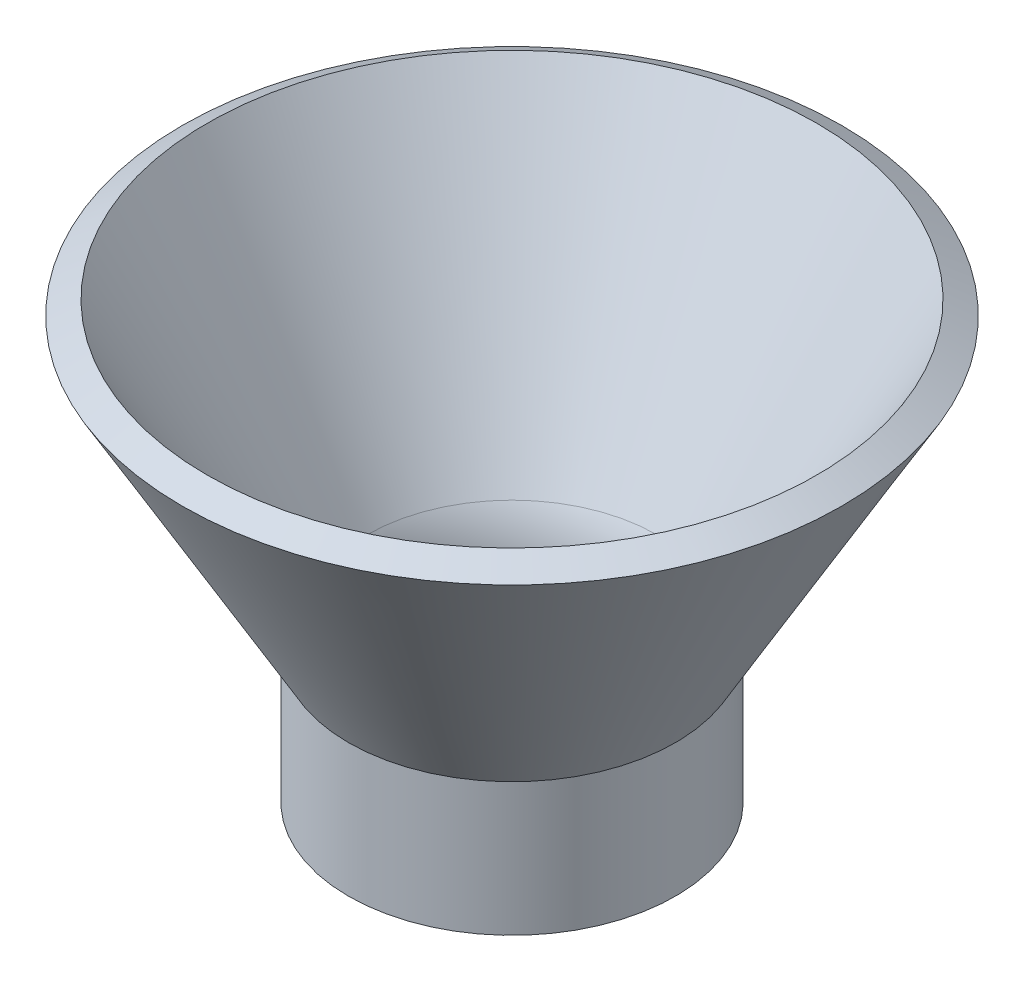
ISO-10303-21;
HEADER;
FILE_DESCRIPTION(('STEP AP214'),'2;1');
FILE_NAME('part.step','',(''),(''),'','','');
FILE_SCHEMA(('AUTOMOTIVE_DESIGN { 1 0 10303 214 1 1 1 1 }'));
ENDSEC;
DATA;
#1=APPLICATION_CONTEXT('core data for automotive mechanical design processes');
#2=APPLICATION_PROTOCOL_DEFINITION('international standard','automotive_design',2000,#1);
#3=PRODUCT_CONTEXT('',#1,'mechanical');
#4=PRODUCT('Part','Part','',(#3));
#5=PRODUCT_RELATED_PRODUCT_CATEGORY('part','',(#4));
#6=PRODUCT_DEFINITION_FORMATION('','',#4);
#7=PRODUCT_DEFINITION_CONTEXT('part definition',#1,'design');
#8=PRODUCT_DEFINITION('design','',#6,#7);
#9=PRODUCT_DEFINITION_SHAPE('','',#8);
#10=(LENGTH_UNIT() NAMED_UNIT(*) SI_UNIT(.MILLI.,.METRE.));
#11=(NAMED_UNIT(*) PLANE_ANGLE_UNIT() SI_UNIT($,.RADIAN.));
#12=(NAMED_UNIT(*) SI_UNIT($,.STERADIAN.) SOLID_ANGLE_UNIT());
#13=UNCERTAINTY_MEASURE_WITH_UNIT(LENGTH_MEASURE(1.E-05),#10,'distance_accuracy_value','');
#14=(GEOMETRIC_REPRESENTATION_CONTEXT(3) GLOBAL_UNCERTAINTY_ASSIGNED_CONTEXT((#13)) GLOBAL_UNIT_ASSIGNED_CONTEXT((#10,
#11,#12)) REPRESENTATION_CONTEXT('',''));
#15=CARTESIAN_POINT('',(0.,0.,0.));
#16=DIRECTION('',(0.,0.,1.));
#17=DIRECTION('',(1.,0.,0.));
#18=AXIS2_PLACEMENT_3D('',#15,#16,#17);
#19=CARTESIAN_POINT('',(0.,0.,0.));
#20=DIRECTION('',(0.,1.,0.));
#21=DIRECTION('',(0.,0.,1.));
#22=AXIS2_PLACEMENT_3D('',#19,#20,#21);
#23=PLANE('',#22);
#24=CARTESIAN_POINT('',(0.,0.,0.));
#25=DIRECTION('',(0.,1.,0.));
#26=DIRECTION('',(0.,0.,1.));
#27=AXIS2_PLACEMENT_3D('',#24,#25,#26);
#28=CIRCLE('',#27,14.75);
#29=CARTESIAN_POINT('',(0.,0.,14.75));
#30=VERTEX_POINT('',#29);
#31=EDGE_CURVE('E55',#30,#30,#28,.T.);
#32=ORIENTED_EDGE('',*,*,#31,.F.);
#33=EDGE_LOOP('',(#32));
#34=FACE_BOUND('',#33,.T.);
#35=CARTESIAN_POINT('',(0.,0.,0.));
#36=DIRECTION('',(0.,1.,0.));
#37=DIRECTION('',(0.,0.,1.));
#38=AXIS2_PLACEMENT_3D('',#35,#36,#37);
#39=CIRCLE('',#38,11.75);
#40=CARTESIAN_POINT('',(0.,0.,11.75));
#41=VERTEX_POINT('',#40);
#42=EDGE_CURVE('E60',#41,#41,#39,.T.);
#43=ORIENTED_EDGE('',*,*,#42,.T.);
#44=EDGE_LOOP('',(#43));
#45=FACE_BOUND('',#44,.T.);
#46=ADVANCED_FACE('F37',(#34,#45),#23,.F.);
#47=CARTESIAN_POINT('',(0.,12.,0.));
#48=DIRECTION('',(0.,-1.,0.));
#49=DIRECTION('',(0.,0.,-1.));
#50=AXIS2_PLACEMENT_3D('',#47,#48,#49);
#51=CYLINDRICAL_SURFACE('',#50,14.75);
#52=CARTESIAN_POINT('',(0.,12.,0.));
#53=DIRECTION('',(0.,1.,0.));
#54=DIRECTION('',(0.,0.,1.));
#55=AXIS2_PLACEMENT_3D('',#52,#53,#54);
#56=CIRCLE('',#55,14.75);
#57=CARTESIAN_POINT('',(0.,12.,14.75));
#58=VERTEX_POINT('',#57);
#59=EDGE_CURVE('E50',#58,#58,#56,.T.);
#60=ORIENTED_EDGE('',*,*,#59,.F.);
#61=EDGE_LOOP('',(#60));
#62=FACE_BOUND('',#61,.T.);
#63=ORIENTED_EDGE('',*,*,#31,.T.);
#64=EDGE_LOOP('',(#63));
#65=FACE_BOUND('',#64,.T.);
#66=ADVANCED_FACE('F88',(#62,#65),#51,.T.);
#67=CARTESIAN_POINT('',(0.,12.,0.));
#68=DIRECTION('',(0.,-1.,0.));
#69=DIRECTION('',(0.,0.,-1.));
#70=AXIS2_PLACEMENT_3D('',#67,#68,#69);
#71=CYLINDRICAL_SURFACE('',#70,11.75);
#72=CARTESIAN_POINT('',(0.,9.3205080756888,0.));
#73=DIRECTION('',(0.,1.,0.));
#74=DIRECTION('',(0.,0.,1.));
#75=AXIS2_PLACEMENT_3D('',#72,#73,#74);
#76=CIRCLE('',#75,11.75);
#77=CARTESIAN_POINT('',(0.,9.3205080756888,11.75));
#78=VERTEX_POINT('',#77);
#79=EDGE_CURVE('E10',#78,#78,#76,.T.);
#80=ORIENTED_EDGE('',*,*,#79,.T.);
#81=EDGE_LOOP('',(#80));
#82=FACE_BOUND('',#81,.T.);
#83=ORIENTED_EDGE('',*,*,#42,.F.);
#84=EDGE_LOOP('',(#83));
#85=FACE_BOUND('',#84,.T.);
#86=ADVANCED_FACE('F94',(#82,#85),#71,.F.);
#87=CARTESIAN_POINT('',(0.,37.9807621135332,0.));
#88=DIRECTION('',(0.,1.,0.));
#89=DIRECTION('',(0.,0.,1.));
#90=AXIS2_PLACEMENT_3D('',#87,#88,#89);
#91=CONICAL_SURFACE('',#90,29.7499999999999,0.523598775598293);
#92=ORIENTED_EDGE('',*,*,#59,.T.);
#93=EDGE_LOOP('',(#92));
#94=FACE_BOUND('',#93,.T.);
#95=CARTESIAN_POINT('',(0.,37.9807621135332,0.));
#96=DIRECTION('',(0.,-1.,0.));
#97=DIRECTION('',(0.,0.,-1.));
#98=AXIS2_PLACEMENT_3D('',#95,#96,#97);
#99=CIRCLE('',#98,29.7499999999999);
#100=CARTESIAN_POINT('',(0.,37.9807621135332,-29.7499999999999));
#101=VERTEX_POINT('',#100);
#102=EDGE_CURVE('E65',#101,#101,#99,.T.);
#103=ORIENTED_EDGE('',*,*,#102,.T.);
#104=EDGE_LOOP('',(#103));
#105=FACE_BOUND('',#104,.T.);
#106=ADVANCED_FACE('F84',(#94,#105),#91,.T.);
#107=CARTESIAN_POINT('',(0.,39.2798002192099,0.));
#108=DIRECTION('',(0.,-1.,0.));
#109=DIRECTION('',(0.,0.,-1.));
#110=AXIS2_PLACEMENT_3D('',#107,#108,#109);
#111=CONICAL_SURFACE('',#110,27.4999999999998,1.0471975511966);
#112=ORIENTED_EDGE('',*,*,#102,.F.);
#113=EDGE_LOOP('',(#112));
#114=FACE_BOUND('',#113,.T.);
#115=CARTESIAN_POINT('',(0.,39.2798002192099,0.));
#116=DIRECTION('',(0.,-1.,0.));
#117=DIRECTION('',(0.,0.,-1.));
#118=AXIS2_PLACEMENT_3D('',#115,#116,#117);
#119=CIRCLE('',#118,27.4999999999998);
#120=CARTESIAN_POINT('',(0.,39.2798002192099,-27.4999999999998));
#121=VERTEX_POINT('',#120);
#122=EDGE_CURVE('E69',#121,#121,#119,.T.);
#123=ORIENTED_EDGE('',*,*,#122,.T.);
#124=EDGE_LOOP('',(#123));
#125=FACE_BOUND('',#124,.T.);
#126=ADVANCED_FACE('F74',(#114,#125),#111,.T.);
#127=CARTESIAN_POINT('',(0.,12.,0.));
#128=DIRECTION('',(0.,1.,0.));
#129=DIRECTION('',(0.,0.,1.));
#130=AXIS2_PLACEMENT_3D('',#127,#128,#129);
#131=CONICAL_SURFACE('',#130,11.75,0.523598775598293);
#132=CARTESIAN_POINT('',(0.,14.3205080756887,0.));
#133=DIRECTION('',(0.,1.,0.));
#134=DIRECTION('',(0.,0.,1.));
#135=AXIS2_PLACEMENT_3D('',#132,#133,#134);
#136=CIRCLE('',#135,13.0897459621556);
#137=CARTESIAN_POINT('',(0.,14.3205080756887,13.0897459621556));
#138=VERTEX_POINT('',#137);
#139=EDGE_CURVE('E45',#138,#138,#136,.F.);
#140=ORIENTED_EDGE('',*,*,#139,.T.);
#141=EDGE_LOOP('',(#140));
#142=FACE_BOUND('',#141,.T.);
#143=ORIENTED_EDGE('',*,*,#122,.F.);
#144=EDGE_LOOP('',(#143));
#145=FACE_BOUND('',#144,.T.);
#146=ADVANCED_FACE('F76',(#142,#145),#131,.F.);
#147=CARTESIAN_POINT('',(0.,9.3205080756888,0.));
#148=DIRECTION('',(0.,1.,0.));
#149=DIRECTION('',(0.,0.,1.));
#150=AXIS2_PLACEMENT_3D('',#147,#148,#149);
#151=TOROIDAL_SURFACE('',#150,21.75,10.);
#152=ORIENTED_EDGE('',*,*,#79,.F.);
#153=EDGE_LOOP('',(#152));
#154=FACE_BOUND('',#153,.T.);
#155=ORIENTED_EDGE('',*,*,#139,.F.);
#156=EDGE_LOOP('',(#155));
#157=FACE_BOUND('',#156,.T.);
#158=ADVANCED_FACE('F39',(#154,#157),#151,.T.);
#159=CLOSED_SHELL('',(#46,#66,#86,#106,#126,#146,#158));
#160=MANIFOLD_SOLID_BREP('B2',#159);
#161=ADVANCED_BREP_SHAPE_REPRESENTATION('',(#18,#160),#14);
#162=SHAPE_DEFINITION_REPRESENTATION(#9,#161);
ENDSEC;
END-ISO-10303-21;
